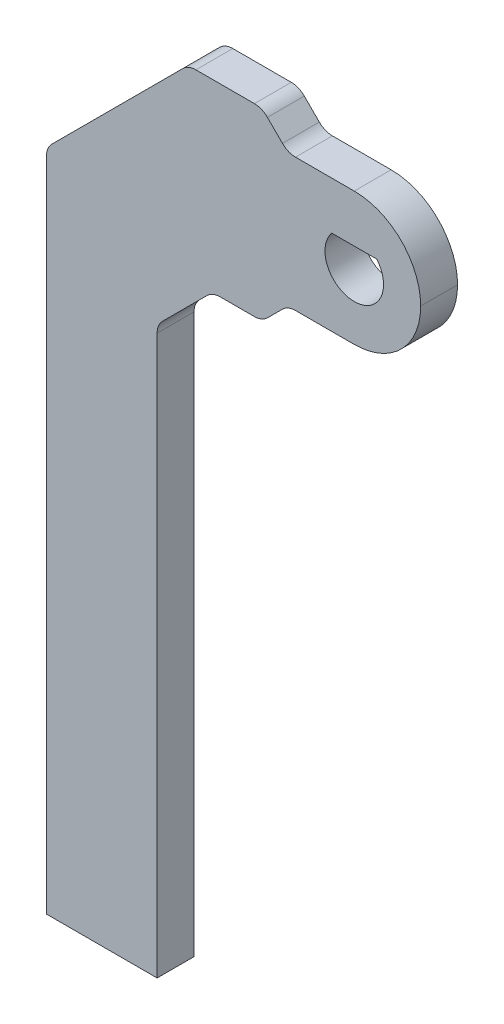
ISO-10303-21;
HEADER;
FILE_DESCRIPTION(('STEP AP214'),'2;1');
FILE_NAME('part.step','',(''),(''),'','','');
FILE_SCHEMA(('AUTOMOTIVE_DESIGN { 1 0 10303 214 1 1 1 1 }'));
ENDSEC;
DATA;
#1=APPLICATION_CONTEXT('core data for automotive mechanical design processes');
#2=APPLICATION_PROTOCOL_DEFINITION('international standard','automotive_design',2000,#1);
#3=PRODUCT_CONTEXT('',#1,'mechanical');
#4=PRODUCT('Part','Part','',(#3));
#5=PRODUCT_RELATED_PRODUCT_CATEGORY('part','',(#4));
#6=PRODUCT_DEFINITION_FORMATION('','',#4);
#7=PRODUCT_DEFINITION_CONTEXT('part definition',#1,'design');
#8=PRODUCT_DEFINITION('design','',#6,#7);
#9=PRODUCT_DEFINITION_SHAPE('','',#8);
#10=(LENGTH_UNIT() NAMED_UNIT(*) SI_UNIT(.MILLI.,.METRE.));
#11=(NAMED_UNIT(*) PLANE_ANGLE_UNIT() SI_UNIT($,.RADIAN.));
#12=(NAMED_UNIT(*) SI_UNIT($,.STERADIAN.) SOLID_ANGLE_UNIT());
#13=UNCERTAINTY_MEASURE_WITH_UNIT(LENGTH_MEASURE(1.E-05),#10,'distance_accuracy_value','');
#14=(GEOMETRIC_REPRESENTATION_CONTEXT(3) GLOBAL_UNCERTAINTY_ASSIGNED_CONTEXT((#13)) GLOBAL_UNIT_ASSIGNED_CONTEXT((#10,
#11,#12)) REPRESENTATION_CONTEXT('',''));
#15=CARTESIAN_POINT('',(0.,0.,0.));
#16=DIRECTION('',(0.,0.,1.));
#17=DIRECTION('',(1.,0.,0.));
#18=AXIS2_PLACEMENT_3D('',#15,#16,#17);
#19=CARTESIAN_POINT('',(0.,0.,5.));
#20=DIRECTION('',(0.,0.,-1.));
#21=DIRECTION('',(-1.,0.,0.));
#22=AXIS2_PLACEMENT_3D('',#19,#20,#21);
#23=PLANE('',#22);
#24=DIRECTION('',(1.,0.,0.));
#25=VECTOR('',#24,1.);
#26=CARTESIAN_POINT('',(29.2157287525381,84.2157287525381,5.));
#27=LINE('',#26,#25);
#28=CARTESIAN_POINT('',(23.5355339059327,84.2157287525381,5.));
#29=VERTEX_POINT('',#28);
#30=CARTESIAN_POINT('',(28.1801948466054,84.2157287525381,5.));
#31=VERTEX_POINT('',#30);
#32=EDGE_CURVE('E226',#29,#31,#27,.T.);
#33=ORIENTED_EDGE('',*,*,#32,.T.);
#34=CARTESIAN_POINT('',(28.1801948466054,86.7157287525381,5.));
#35=DIRECTION('',(0.,0.,-1.));
#36=DIRECTION('',(-1.,0.,0.));
#37=AXIS2_PLACEMENT_3D('',#34,#35,#36);
#38=CIRCLE('',#37,2.5);
#39=CARTESIAN_POINT('',(29.9479617995718,84.9479617995717,5.));
#40=VERTEX_POINT('',#39);
#41=EDGE_CURVE('E325',#31,#40,#38,.F.);
#42=ORIENTED_EDGE('',*,*,#41,.T.);
#43=DIRECTION('',(0.707106781186539,0.707106781186556,0.));
#44=VECTOR('',#43,1.);
#45=CARTESIAN_POINT('',(29.2157287525381,84.2157287525381,5.));
#46=LINE('',#45,#44);
#47=CARTESIAN_POINT('',(31.9834957055044,86.9834957055045,5.));
#48=VERTEX_POINT('',#47);
#49=EDGE_CURVE('E229',#40,#48,#46,.T.);
#50=ORIENTED_EDGE('',*,*,#49,.T.);
#51=CARTESIAN_POINT('',(33.7512626584708,85.2157287525381,5.));
#52=DIRECTION('',(0.,0.,-1.));
#53=DIRECTION('',(-1.,0.,0.));
#54=AXIS2_PLACEMENT_3D('',#51,#52,#53);
#55=CIRCLE('',#54,2.5);
#56=CARTESIAN_POINT('',(33.7512626584708,87.7157287525381,5.));
#57=VERTEX_POINT('',#56);
#58=EDGE_CURVE('E359',#48,#57,#55,.T.);
#59=ORIENTED_EDGE('',*,*,#58,.T.);
#60=DIRECTION('',(1.,0.,0.));
#61=VECTOR('',#60,1.);
#62=CARTESIAN_POINT('',(32.7157287525381,87.7157287525381,5.));
#63=LINE('',#62,#61);
#64=CARTESIAN_POINT('',(41.7157287525381,87.7157287525381,5.));
#65=VERTEX_POINT('',#64);
#66=EDGE_CURVE('E232',#57,#65,#63,.T.);
#67=ORIENTED_EDGE('',*,*,#66,.T.);
#68=CARTESIAN_POINT('',(41.7157287525381,96.7157287525381,5.));
#69=DIRECTION('',(0.,0.,-1.));
#70=DIRECTION('',(-1.,0.,0.));
#71=AXIS2_PLACEMENT_3D('',#68,#69,#70);
#72=CIRCLE('',#71,9.);
#73=CARTESIAN_POINT('',(50.7157287525381,96.7157287525381,5.));
#74=VERTEX_POINT('',#73);
#75=EDGE_CURVE('E291',#65,#74,#72,.F.);
#76=ORIENTED_EDGE('',*,*,#75,.T.);
#77=CARTESIAN_POINT('',(41.7157287525381,96.7157287525381,5.));
#78=DIRECTION('',(0.,0.,-1.));
#79=DIRECTION('',(-1.,0.,0.));
#80=AXIS2_PLACEMENT_3D('',#77,#78,#79);
#81=CIRCLE('',#80,9.);
#82=CARTESIAN_POINT('',(41.7157287525381,105.715728752538,5.));
#83=VERTEX_POINT('',#82);
#84=EDGE_CURVE('E289',#74,#83,#81,.F.);
#85=ORIENTED_EDGE('',*,*,#84,.T.);
#86=DIRECTION('',(-1.,0.,0.));
#87=VECTOR('',#86,1.);
#88=CARTESIAN_POINT('',(50.7157287525381,105.715728752538,5.));
#89=LINE('',#88,#87);
#90=CARTESIAN_POINT('',(33.7512626584708,105.715728752538,5.));
#91=VERTEX_POINT('',#90);
#92=EDGE_CURVE('E234',#83,#91,#89,.T.);
#93=ORIENTED_EDGE('',*,*,#92,.T.);
#94=CARTESIAN_POINT('',(33.7512626584708,108.215728752538,5.));
#95=DIRECTION('',(0.,0.,-1.));
#96=DIRECTION('',(-1.,0.,0.));
#97=AXIS2_PLACEMENT_3D('',#94,#95,#96);
#98=CIRCLE('',#97,2.5);
#99=CARTESIAN_POINT('',(31.9834957055045,106.447961799572,5.));
#100=VERTEX_POINT('',#99);
#101=EDGE_CURVE('E11',#91,#100,#98,.T.);
#102=ORIENTED_EDGE('',*,*,#101,.T.);
#103=DIRECTION('',(-0.707106781186544,0.707106781186551,0.));
#104=VECTOR('',#103,1.);
#105=CARTESIAN_POINT('',(32.7157287525381,105.715728752538,5.));
#106=LINE('',#105,#104);
#107=CARTESIAN_POINT('',(29.9479617995718,108.483495705504,5.));
#108=VERTEX_POINT('',#107);
#109=EDGE_CURVE('E237',#100,#108,#106,.T.);
#110=ORIENTED_EDGE('',*,*,#109,.T.);
#111=CARTESIAN_POINT('',(28.1801948466054,106.715728752538,5.));
#112=DIRECTION('',(0.,0.,-1.));
#113=DIRECTION('',(-1.,0.,0.));
#114=AXIS2_PLACEMENT_3D('',#111,#112,#113);
#115=CIRCLE('',#114,2.5);
#116=CARTESIAN_POINT('',(28.1801948466054,109.215728752538,5.));
#117=VERTEX_POINT('',#116);
#118=EDGE_CURVE('E320',#108,#117,#115,.F.);
#119=ORIENTED_EDGE('',*,*,#118,.T.);
#120=DIRECTION('',(-1.,0.,0.));
#121=VECTOR('',#120,1.);
#122=CARTESIAN_POINT('',(19.2157287525381,109.215728752538,5.));
#123=LINE('',#122,#121);
#124=CARTESIAN_POINT('',(20.2512626584709,109.215728752538,5.));
#125=VERTEX_POINT('',#124);
#126=EDGE_CURVE('E240',#117,#125,#123,.T.);
#127=ORIENTED_EDGE('',*,*,#126,.T.);
#128=CARTESIAN_POINT('',(20.2512626584709,106.715728752538,5.));
#129=DIRECTION('',(0.,0.,-1.));
#130=DIRECTION('',(-1.,0.,0.));
#131=AXIS2_PLACEMENT_3D('',#128,#129,#130);
#132=CIRCLE('',#131,2.5);
#133=CARTESIAN_POINT('',(18.4834957055045,108.483495705504,5.));
#134=VERTEX_POINT('',#133);
#135=EDGE_CURVE('E322',#125,#134,#132,.F.);
#136=ORIENTED_EDGE('',*,*,#135,.T.);
#137=DIRECTION('',(-0.707106781186548,-0.707106781186547,0.));
#138=VECTOR('',#137,1.);
#139=CARTESIAN_POINT('',(0.,90.,5.));
#140=LINE('',#139,#138);
#141=CARTESIAN_POINT('',(0.732233047033629,90.7322330470336,5.));
#142=VERTEX_POINT('',#141);
#143=EDGE_CURVE('E243',#134,#142,#140,.T.);
#144=ORIENTED_EDGE('',*,*,#143,.T.);
#145=CARTESIAN_POINT('',(2.5,88.9644660940673,5.));
#146=DIRECTION('',(0.,0.,-1.));
#147=DIRECTION('',(-1.,0.,0.));
#148=AXIS2_PLACEMENT_3D('',#145,#146,#147);
#149=CIRCLE('',#148,2.5);
#150=CARTESIAN_POINT('',(0.,88.9644660940672,5.));
#151=VERTEX_POINT('',#150);
#152=EDGE_CURVE('E48',#142,#151,#149,.F.);
#153=ORIENTED_EDGE('',*,*,#152,.T.);
#154=DIRECTION('',(0.,-1.,0.));
#155=VECTOR('',#154,1.);
#156=CARTESIAN_POINT('',(0.,0.,5.));
#157=LINE('',#156,#155);
#158=CARTESIAN_POINT('',(0.,0.,5.));
#159=VERTEX_POINT('',#158);
#160=EDGE_CURVE('E245',#151,#159,#157,.T.);
#161=ORIENTED_EDGE('',*,*,#160,.T.);
#162=DIRECTION('',(1.,0.,0.));
#163=VECTOR('',#162,1.);
#164=CARTESIAN_POINT('',(15.,0.,5.));
#165=LINE('',#164,#163);
#166=CARTESIAN_POINT('',(15.,0.,5.));
#167=VERTEX_POINT('',#166);
#168=EDGE_CURVE('E216',#159,#167,#165,.T.);
#169=ORIENTED_EDGE('',*,*,#168,.T.);
#170=DIRECTION('',(0.,1.,0.));
#171=VECTOR('',#170,1.);
#172=CARTESIAN_POINT('',(15.,76.7157287525381,5.));
#173=LINE('',#172,#171);
#174=CARTESIAN_POINT('',(15.,75.6801948466053,5.));
#175=VERTEX_POINT('',#174);
#176=EDGE_CURVE('E219',#167,#175,#173,.T.);
#177=ORIENTED_EDGE('',*,*,#176,.T.);
#178=CARTESIAN_POINT('',(17.5,75.6801948466053,5.));
#179=DIRECTION('',(0.,0.,-1.));
#180=DIRECTION('',(-1.,0.,0.));
#181=AXIS2_PLACEMENT_3D('',#178,#179,#180);
#182=CIRCLE('',#181,2.5);
#183=CARTESIAN_POINT('',(15.7322330470336,77.4479617995717,5.));
#184=VERTEX_POINT('',#183);
#185=EDGE_CURVE('E351',#175,#184,#182,.T.);
#186=ORIENTED_EDGE('',*,*,#185,.T.);
#187=DIRECTION('',(0.707106781186548,0.707106781186547,0.));
#188=VECTOR('',#187,1.);
#189=CARTESIAN_POINT('',(22.5,84.2157287525381,5.));
#190=LINE('',#189,#188);
#191=CARTESIAN_POINT('',(21.7677669529664,83.4834957055045,5.));
#192=VERTEX_POINT('',#191);
#193=EDGE_CURVE('E223',#184,#192,#190,.T.);
#194=ORIENTED_EDGE('',*,*,#193,.T.);
#195=CARTESIAN_POINT('',(23.5355339059327,81.7157287525381,5.));
#196=DIRECTION('',(0.,0.,-1.));
#197=DIRECTION('',(-1.,0.,0.));
#198=AXIS2_PLACEMENT_3D('',#195,#196,#197);
#199=CIRCLE('',#198,2.5);
#200=EDGE_CURVE('E355',#192,#29,#199,.T.);
#201=ORIENTED_EDGE('',*,*,#200,.T.);
#202=EDGE_LOOP('',(#33,#42,#50,#59,#67,#76,#85,#93,#102,#110,#119,#127,#136,#144,#153,#161,#169,
#177,#186,#194,#201));
#203=FACE_BOUND('',#202,.T.);
#204=CARTESIAN_POINT('',(41.7157287525381,96.7157287525381,5.));
#205=DIRECTION('',(0.,0.,1.));
#206=DIRECTION('',(1.,0.,0.));
#207=AXIS2_PLACEMENT_3D('',#204,#205,#206);
#208=CIRCLE('',#207,3.96874999999999);
#209=CARTESIAN_POINT('',(38.6662408344607,99.2557287525381,5.));
#210=VERTEX_POINT('',#209);
#211=CARTESIAN_POINT('',(44.7652166706155,99.2557287525381,5.));
#212=VERTEX_POINT('',#211);
#213=EDGE_CURVE('E188',#210,#212,#208,.T.);
#214=ORIENTED_EDGE('',*,*,#213,.F.);
#215=DIRECTION('',(1.,0.,0.));
#216=VECTOR('',#215,1.);
#217=CARTESIAN_POINT('',(38.6662408344607,99.2557287525381,5.));
#218=LINE('',#217,#216);
#219=EDGE_CURVE('E191',#210,#212,#218,.T.);
#220=ORIENTED_EDGE('',*,*,#219,.T.);
#221=EDGE_LOOP('',(#214,#220));
#222=FACE_BOUND('',#221,.T.);
#223=ADVANCED_FACE('F33',(#203,#222),#23,.F.);
#224=CARTESIAN_POINT('',(0.,0.,0.));
#225=DIRECTION('',(0.,0.,-1.));
#226=DIRECTION('',(-1.,0.,0.));
#227=AXIS2_PLACEMENT_3D('',#224,#225,#226);
#228=PLANE('',#227);
#229=DIRECTION('',(0.707106781186539,0.707106781186556,0.));
#230=VECTOR('',#229,1.);
#231=CARTESIAN_POINT('',(29.2157287525381,84.2157287525381,0.));
#232=LINE('',#231,#230);
#233=CARTESIAN_POINT('',(29.9479617995718,84.9479617995717,0.));
#234=VERTEX_POINT('',#233);
#235=CARTESIAN_POINT('',(31.9834957055044,86.9834957055045,0.));
#236=VERTEX_POINT('',#235);
#237=EDGE_CURVE('E259',#234,#236,#232,.T.);
#238=ORIENTED_EDGE('',*,*,#237,.F.);
#239=CARTESIAN_POINT('',(28.1801948466054,86.7157287525381,0.));
#240=DIRECTION('',(0.,0.,-1.));
#241=DIRECTION('',(-1.,0.,0.));
#242=AXIS2_PLACEMENT_3D('',#239,#240,#241);
#243=CIRCLE('',#242,2.5);
#244=CARTESIAN_POINT('',(28.1801948466054,84.2157287525381,0.));
#245=VERTEX_POINT('',#244);
#246=EDGE_CURVE('E318',#234,#245,#243,.T.);
#247=ORIENTED_EDGE('',*,*,#246,.T.);
#248=DIRECTION('',(1.,0.,0.));
#249=VECTOR('',#248,1.);
#250=CARTESIAN_POINT('',(29.2157287525381,84.2157287525381,0.));
#251=LINE('',#250,#249);
#252=CARTESIAN_POINT('',(23.5355339059327,84.2157287525381,0.));
#253=VERTEX_POINT('',#252);
#254=EDGE_CURVE('E256',#253,#245,#251,.T.);
#255=ORIENTED_EDGE('',*,*,#254,.F.);
#256=CARTESIAN_POINT('',(23.5355339059327,81.7157287525381,0.));
#257=DIRECTION('',(0.,0.,-1.));
#258=DIRECTION('',(-1.,0.,0.));
#259=AXIS2_PLACEMENT_3D('',#256,#257,#258);
#260=CIRCLE('',#259,2.5);
#261=CARTESIAN_POINT('',(21.7677669529664,83.4834957055045,0.));
#262=VERTEX_POINT('',#261);
#263=EDGE_CURVE('E353',#253,#262,#260,.F.);
#264=ORIENTED_EDGE('',*,*,#263,.T.);
#265=DIRECTION('',(0.707106781186548,0.707106781186547,0.));
#266=VECTOR('',#265,1.);
#267=CARTESIAN_POINT('',(22.5,84.2157287525381,0.));
#268=LINE('',#267,#266);
#269=CARTESIAN_POINT('',(15.7322330470336,77.4479617995717,0.));
#270=VERTEX_POINT('',#269);
#271=EDGE_CURVE('E253',#270,#262,#268,.T.);
#272=ORIENTED_EDGE('',*,*,#271,.F.);
#273=CARTESIAN_POINT('',(17.5,75.6801948466053,0.));
#274=DIRECTION('',(0.,0.,-1.));
#275=DIRECTION('',(-1.,0.,0.));
#276=AXIS2_PLACEMENT_3D('',#273,#274,#275);
#277=CIRCLE('',#276,2.5);
#278=CARTESIAN_POINT('',(15.,75.6801948466053,0.));
#279=VERTEX_POINT('',#278);
#280=EDGE_CURVE('E349',#270,#279,#277,.F.);
#281=ORIENTED_EDGE('',*,*,#280,.T.);
#282=DIRECTION('',(0.,1.,0.));
#283=VECTOR('',#282,1.);
#284=CARTESIAN_POINT('',(15.,76.7157287525381,0.));
#285=LINE('',#284,#283);
#286=CARTESIAN_POINT('',(15.,0.,0.));
#287=VERTEX_POINT('',#286);
#288=EDGE_CURVE('E250',#287,#279,#285,.T.);
#289=ORIENTED_EDGE('',*,*,#288,.F.);
#290=DIRECTION('',(1.,0.,0.));
#291=VECTOR('',#290,1.);
#292=CARTESIAN_POINT('',(15.,0.,0.));
#293=LINE('',#292,#291);
#294=CARTESIAN_POINT('',(0.,0.,0.));
#295=VERTEX_POINT('',#294);
#296=EDGE_CURVE('E194',#295,#287,#293,.T.);
#297=ORIENTED_EDGE('',*,*,#296,.F.);
#298=DIRECTION('',(0.,-1.,0.));
#299=VECTOR('',#298,1.);
#300=CARTESIAN_POINT('',(0.,0.,0.));
#301=LINE('',#300,#299);
#302=CARTESIAN_POINT('',(0.,88.9644660940672,0.));
#303=VERTEX_POINT('',#302);
#304=EDGE_CURVE('E220',#303,#295,#301,.T.);
#305=ORIENTED_EDGE('',*,*,#304,.F.);
#306=CARTESIAN_POINT('',(2.5,88.9644660940673,0.));
#307=DIRECTION('',(0.,0.,-1.));
#308=DIRECTION('',(-1.,0.,0.));
#309=AXIS2_PLACEMENT_3D('',#306,#307,#308);
#310=CIRCLE('',#309,2.5);
#311=CARTESIAN_POINT('',(0.732233047033629,90.7322330470336,0.));
#312=VERTEX_POINT('',#311);
#313=EDGE_CURVE('E316',#303,#312,#310,.T.);
#314=ORIENTED_EDGE('',*,*,#313,.T.);
#315=DIRECTION('',(-0.707106781186548,-0.707106781186547,0.));
#316=VECTOR('',#315,1.);
#317=CARTESIAN_POINT('',(0.,90.,0.));
#318=LINE('',#317,#316);
#319=CARTESIAN_POINT('',(18.4834957055045,108.483495705504,0.));
#320=VERTEX_POINT('',#319);
#321=EDGE_CURVE('E273',#320,#312,#318,.T.);
#322=ORIENTED_EDGE('',*,*,#321,.F.);
#323=CARTESIAN_POINT('',(20.2512626584709,106.715728752538,0.));
#324=DIRECTION('',(0.,0.,-1.));
#325=DIRECTION('',(-1.,0.,0.));
#326=AXIS2_PLACEMENT_3D('',#323,#324,#325);
#327=CIRCLE('',#326,2.5);
#328=CARTESIAN_POINT('',(20.2512626584709,109.215728752538,0.));
#329=VERTEX_POINT('',#328);
#330=EDGE_CURVE('E314',#320,#329,#327,.T.);
#331=ORIENTED_EDGE('',*,*,#330,.T.);
#332=DIRECTION('',(-1.,0.,0.));
#333=VECTOR('',#332,1.);
#334=CARTESIAN_POINT('',(19.2157287525381,109.215728752538,0.));
#335=LINE('',#334,#333);
#336=CARTESIAN_POINT('',(28.1801948466054,109.215728752538,0.));
#337=VERTEX_POINT('',#336);
#338=EDGE_CURVE('E270',#337,#329,#335,.T.);
#339=ORIENTED_EDGE('',*,*,#338,.F.);
#340=CARTESIAN_POINT('',(28.1801948466054,106.715728752538,0.));
#341=DIRECTION('',(0.,0.,-1.));
#342=DIRECTION('',(-1.,0.,0.));
#343=AXIS2_PLACEMENT_3D('',#340,#341,#342);
#344=CIRCLE('',#343,2.5);
#345=CARTESIAN_POINT('',(29.9479617995718,108.483495705504,0.));
#346=VERTEX_POINT('',#345);
#347=EDGE_CURVE('E312',#337,#346,#344,.T.);
#348=ORIENTED_EDGE('',*,*,#347,.T.);
#349=DIRECTION('',(-0.707106781186544,0.707106781186551,0.));
#350=VECTOR('',#349,1.);
#351=CARTESIAN_POINT('',(32.7157287525381,105.715728752538,0.));
#352=LINE('',#351,#350);
#353=CARTESIAN_POINT('',(31.9834957055045,106.447961799572,0.));
#354=VERTEX_POINT('',#353);
#355=EDGE_CURVE('E267',#354,#346,#352,.T.);
#356=ORIENTED_EDGE('',*,*,#355,.F.);
#357=CARTESIAN_POINT('',(33.7512626584708,108.215728752538,0.));
#358=DIRECTION('',(0.,0.,-1.));
#359=DIRECTION('',(-1.,0.,0.));
#360=AXIS2_PLACEMENT_3D('',#357,#358,#359);
#361=CIRCLE('',#360,2.5);
#362=CARTESIAN_POINT('',(33.7512626584708,105.715728752538,0.));
#363=VERTEX_POINT('',#362);
#364=EDGE_CURVE('E41',#354,#363,#361,.F.);
#365=ORIENTED_EDGE('',*,*,#364,.T.);
#366=DIRECTION('',(-1.,0.,0.));
#367=VECTOR('',#366,1.);
#368=CARTESIAN_POINT('',(50.7157287525381,105.715728752538,0.));
#369=LINE('',#368,#367);
#370=CARTESIAN_POINT('',(41.7157287525381,105.715728752538,0.));
#371=VERTEX_POINT('',#370);
#372=EDGE_CURVE('E264',#371,#363,#369,.T.);
#373=ORIENTED_EDGE('',*,*,#372,.F.);
#374=CARTESIAN_POINT('',(41.7157287525381,96.7157287525381,0.));
#375=DIRECTION('',(0.,0.,-1.));
#376=DIRECTION('',(-1.,0.,0.));
#377=AXIS2_PLACEMENT_3D('',#374,#375,#376);
#378=CIRCLE('',#377,9.);
#379=CARTESIAN_POINT('',(50.7157287525381,96.7157287525381,0.));
#380=VERTEX_POINT('',#379);
#381=EDGE_CURVE('E281',#371,#380,#378,.T.);
#382=ORIENTED_EDGE('',*,*,#381,.T.);
#383=CARTESIAN_POINT('',(41.7157287525381,96.7157287525381,0.));
#384=DIRECTION('',(0.,0.,-1.));
#385=DIRECTION('',(-1.,0.,0.));
#386=AXIS2_PLACEMENT_3D('',#383,#384,#385);
#387=CIRCLE('',#386,9.);
#388=CARTESIAN_POINT('',(41.7157287525381,87.7157287525381,0.));
#389=VERTEX_POINT('',#388);
#390=EDGE_CURVE('E283',#380,#389,#387,.T.);
#391=ORIENTED_EDGE('',*,*,#390,.T.);
#392=DIRECTION('',(1.,0.,0.));
#393=VECTOR('',#392,1.);
#394=CARTESIAN_POINT('',(32.7157287525381,87.7157287525381,0.));
#395=LINE('',#394,#393);
#396=CARTESIAN_POINT('',(33.7512626584708,87.7157287525381,0.));
#397=VERTEX_POINT('',#396);
#398=EDGE_CURVE('E262',#397,#389,#395,.T.);
#399=ORIENTED_EDGE('',*,*,#398,.F.);
#400=CARTESIAN_POINT('',(33.7512626584708,85.2157287525381,0.));
#401=DIRECTION('',(0.,0.,-1.));
#402=DIRECTION('',(-1.,0.,0.));
#403=AXIS2_PLACEMENT_3D('',#400,#401,#402);
#404=CIRCLE('',#403,2.5);
#405=EDGE_CURVE('E357',#397,#236,#404,.F.);
#406=ORIENTED_EDGE('',*,*,#405,.T.);
#407=EDGE_LOOP('',(#238,#247,#255,#264,#272,#281,#289,#297,#305,#314,#322,#331,#339,#348,#356,
#365,#373,#382,#391,#399,#406));
#408=FACE_BOUND('',#407,.T.);
#409=CARTESIAN_POINT('',(41.7157287525381,96.7157287525381,0.));
#410=DIRECTION('',(0.,0.,1.));
#411=DIRECTION('',(1.,0.,0.));
#412=AXIS2_PLACEMENT_3D('',#409,#410,#411);
#413=CIRCLE('',#412,3.96874999999999);
#414=CARTESIAN_POINT('',(38.6662408344607,99.2557287525381,0.));
#415=VERTEX_POINT('',#414);
#416=CARTESIAN_POINT('',(44.7652166706155,99.2557287525381,0.));
#417=VERTEX_POINT('',#416);
#418=EDGE_CURVE('E195',#415,#417,#413,.T.);
#419=ORIENTED_EDGE('',*,*,#418,.T.);
#420=DIRECTION('',(1.,0.,0.));
#421=VECTOR('',#420,1.);
#422=CARTESIAN_POINT('',(38.6662408344607,99.2557287525381,0.));
#423=LINE('',#422,#421);
#424=EDGE_CURVE('E205',#415,#417,#423,.T.);
#425=ORIENTED_EDGE('',*,*,#424,.F.);
#426=EDGE_LOOP('',(#419,#425));
#427=FACE_BOUND('',#426,.T.);
#428=ADVANCED_FACE('F364',(#408,#427),#228,.T.);
#429=CARTESIAN_POINT('',(15.,0.,5.));
#430=DIRECTION('',(0.,1.,0.));
#431=DIRECTION('',(0.,0.,1.));
#432=AXIS2_PLACEMENT_3D('',#429,#430,#431);
#433=PLANE('',#432);
#434=ORIENTED_EDGE('',*,*,#296,.T.);
#435=DIRECTION('',(0.,0.,-1.));
#436=VECTOR('',#435,1.);
#437=CARTESIAN_POINT('',(15.,0.,5.));
#438=LINE('',#437,#436);
#439=EDGE_CURVE('E278',#167,#287,#438,.T.);
#440=ORIENTED_EDGE('',*,*,#439,.F.);
#441=ORIENTED_EDGE('',*,*,#168,.F.);
#442=DIRECTION('',(0.,0.,-1.));
#443=VECTOR('',#442,1.);
#444=CARTESIAN_POINT('',(0.,0.,5.));
#445=LINE('',#444,#443);
#446=EDGE_CURVE('E247',#159,#295,#445,.T.);
#447=ORIENTED_EDGE('',*,*,#446,.T.);
#448=EDGE_LOOP('',(#434,#440,#441,#447));
#449=FACE_BOUND('',#448,.T.);
#450=ADVANCED_FACE('F406',(#449),#433,.F.);
#451=CARTESIAN_POINT('',(15.,76.7157287525381,5.));
#452=DIRECTION('',(-1.,0.,0.));
#453=DIRECTION('',(0.,-1.,0.));
#454=AXIS2_PLACEMENT_3D('',#451,#452,#453);
#455=PLANE('',#454);
#456=ORIENTED_EDGE('',*,*,#288,.T.);
#457=DIRECTION('',(0.,0.,-1.));
#458=VECTOR('',#457,1.);
#459=CARTESIAN_POINT('',(15.,75.6801948466053,5.));
#460=LINE('',#459,#458);
#461=EDGE_CURVE('E300',#279,#175,#460,.F.);
#462=ORIENTED_EDGE('',*,*,#461,.T.);
#463=ORIENTED_EDGE('',*,*,#176,.F.);
#464=ORIENTED_EDGE('',*,*,#439,.T.);
#465=EDGE_LOOP('',(#456,#462,#463,#464));
#466=FACE_BOUND('',#465,.T.);
#467=ADVANCED_FACE('F408',(#466),#455,.F.);
#468=CARTESIAN_POINT('',(22.5,84.2157287525381,5.));
#469=DIRECTION('',(-0.707106781186547,0.707106781186548,0.));
#470=DIRECTION('',(-0.707106781186548,-0.707106781186547,0.));
#471=AXIS2_PLACEMENT_3D('',#468,#469,#470);
#472=PLANE('',#471);
#473=ORIENTED_EDGE('',*,*,#193,.F.);
#474=DIRECTION('',(0.,0.,-1.));
#475=VECTOR('',#474,1.);
#476=CARTESIAN_POINT('',(15.7322330470336,77.4479617995717,0.));
#477=LINE('',#476,#475);
#478=EDGE_CURVE('E297',#184,#270,#477,.T.);
#479=ORIENTED_EDGE('',*,*,#478,.T.);
#480=ORIENTED_EDGE('',*,*,#271,.T.);
#481=DIRECTION('',(0.,0.,-1.));
#482=VECTOR('',#481,1.);
#483=CARTESIAN_POINT('',(21.7677669529664,83.4834957055045,5.));
#484=LINE('',#483,#482);
#485=EDGE_CURVE('E294',#262,#192,#484,.F.);
#486=ORIENTED_EDGE('',*,*,#485,.T.);
#487=EDGE_LOOP('',(#473,#479,#480,#486));
#488=FACE_BOUND('',#487,.T.);
#489=ADVANCED_FACE('F416',(#488),#472,.F.);
#490=CARTESIAN_POINT('',(29.2157287525381,84.2157287525381,5.));
#491=DIRECTION('',(0.,1.,0.));
#492=DIRECTION('',(0.,0.,1.));
#493=AXIS2_PLACEMENT_3D('',#490,#491,#492);
#494=PLANE('',#493);
#495=ORIENTED_EDGE('',*,*,#32,.F.);
#496=DIRECTION('',(0.,0.,-1.));
#497=VECTOR('',#496,1.);
#498=CARTESIAN_POINT('',(23.5355339059327,84.2157287525381,0.));
#499=LINE('',#498,#497);
#500=EDGE_CURVE('E304',#29,#253,#499,.T.);
#501=ORIENTED_EDGE('',*,*,#500,.T.);
#502=ORIENTED_EDGE('',*,*,#254,.T.);
#503=DIRECTION('',(0.,0.,-1.));
#504=VECTOR('',#503,1.);
#505=CARTESIAN_POINT('',(28.1801948466054,84.2157287525381,5.));
#506=LINE('',#505,#504);
#507=EDGE_CURVE('E302',#245,#31,#506,.F.);
#508=ORIENTED_EDGE('',*,*,#507,.T.);
#509=EDGE_LOOP('',(#495,#501,#502,#508));
#510=FACE_BOUND('',#509,.T.);
#511=ADVANCED_FACE('F425',(#510),#494,.F.);
#512=CARTESIAN_POINT('',(29.2157287525381,84.2157287525381,5.));
#513=DIRECTION('',(-0.707106781186556,0.707106781186539,0.));
#514=DIRECTION('',(-0.707106781186539,-0.707106781186556,0.));
#515=AXIS2_PLACEMENT_3D('',#512,#513,#514);
#516=PLANE('',#515);
#517=ORIENTED_EDGE('',*,*,#49,.F.);
#518=DIRECTION('',(0.,0.,-1.));
#519=VECTOR('',#518,1.);
#520=CARTESIAN_POINT('',(29.9479617995718,84.9479617995717,5.));
#521=LINE('',#520,#519);
#522=EDGE_CURVE('E309',#40,#234,#521,.T.);
#523=ORIENTED_EDGE('',*,*,#522,.T.);
#524=ORIENTED_EDGE('',*,*,#237,.T.);
#525=DIRECTION('',(0.,0.,-1.));
#526=VECTOR('',#525,1.);
#527=CARTESIAN_POINT('',(31.9834957055044,86.9834957055045,5.));
#528=LINE('',#527,#526);
#529=EDGE_CURVE('E307',#236,#48,#528,.F.);
#530=ORIENTED_EDGE('',*,*,#529,.T.);
#531=EDGE_LOOP('',(#517,#523,#524,#530));
#532=FACE_BOUND('',#531,.T.);
#533=ADVANCED_FACE('F434',(#532),#516,.F.);
#534=CARTESIAN_POINT('',(32.7157287525381,87.7157287525381,5.));
#535=DIRECTION('',(0.,1.,0.));
#536=DIRECTION('',(-1.,0.,0.));
#537=AXIS2_PLACEMENT_3D('',#534,#535,#536);
#538=PLANE('',#537);
#539=ORIENTED_EDGE('',*,*,#66,.F.);
#540=DIRECTION('',(0.,0.,-1.));
#541=VECTOR('',#540,1.);
#542=CARTESIAN_POINT('',(33.7512626584708,87.7157287525381,0.));
#543=LINE('',#542,#541);
#544=EDGE_CURVE('E327',#57,#397,#543,.T.);
#545=ORIENTED_EDGE('',*,*,#544,.T.);
#546=ORIENTED_EDGE('',*,*,#398,.T.);
#547=DIRECTION('',(0.,0.,-1.));
#548=VECTOR('',#547,1.);
#549=CARTESIAN_POINT('',(41.7157287525381,87.7157287525381,5.));
#550=LINE('',#549,#548);
#551=EDGE_CURVE('E286',#389,#65,#550,.F.);
#552=ORIENTED_EDGE('',*,*,#551,.T.);
#553=EDGE_LOOP('',(#539,#545,#546,#552));
#554=FACE_BOUND('',#553,.T.);
#555=ADVANCED_FACE('F442',(#554),#538,.F.);
#556=CARTESIAN_POINT('',(50.7157287525381,105.715728752538,5.));
#557=DIRECTION('',(0.,-1.,0.));
#558=DIRECTION('',(0.,0.,-1.));
#559=AXIS2_PLACEMENT_3D('',#556,#557,#558);
#560=PLANE('',#559);
#561=ORIENTED_EDGE('',*,*,#372,.T.);
#562=DIRECTION('',(0.,0.,-1.));
#563=VECTOR('',#562,1.);
#564=CARTESIAN_POINT('',(33.7512626584708,105.715728752538,5.));
#565=LINE('',#564,#563);
#566=EDGE_CURVE('E347',#363,#91,#565,.F.);
#567=ORIENTED_EDGE('',*,*,#566,.T.);
#568=ORIENTED_EDGE('',*,*,#92,.F.);
#569=DIRECTION('',(0.,0.,-1.));
#570=VECTOR('',#569,1.);
#571=CARTESIAN_POINT('',(41.7157287525381,105.715728752538,5.));
#572=LINE('',#571,#570);
#573=EDGE_CURVE('E293',#83,#371,#572,.T.);
#574=ORIENTED_EDGE('',*,*,#573,.T.);
#575=EDGE_LOOP('',(#561,#567,#568,#574));
#576=FACE_BOUND('',#575,.T.);
#577=ADVANCED_FACE('F371',(#576),#560,.F.);
#578=CARTESIAN_POINT('',(32.7157287525381,105.715728752538,5.));
#579=DIRECTION('',(-0.707106781186551,-0.707106781186544,0.));
#580=DIRECTION('',(0.707106781186544,-0.707106781186551,0.));
#581=AXIS2_PLACEMENT_3D('',#578,#579,#580);
#582=PLANE('',#581);
#583=ORIENTED_EDGE('',*,*,#355,.T.);
#584=DIRECTION('',(0.,0.,-1.));
#585=VECTOR('',#584,1.);
#586=CARTESIAN_POINT('',(29.9479617995718,108.483495705504,5.));
#587=LINE('',#586,#585);
#588=EDGE_CURVE('E345',#346,#108,#587,.F.);
#589=ORIENTED_EDGE('',*,*,#588,.T.);
#590=ORIENTED_EDGE('',*,*,#109,.F.);
#591=DIRECTION('',(0.,0.,-1.));
#592=VECTOR('',#591,1.);
#593=CARTESIAN_POINT('',(31.9834957055045,106.447961799572,0.));
#594=LINE('',#593,#592);
#595=EDGE_CURVE('E342',#100,#354,#594,.T.);
#596=ORIENTED_EDGE('',*,*,#595,.T.);
#597=EDGE_LOOP('',(#583,#589,#590,#596));
#598=FACE_BOUND('',#597,.T.);
#599=ADVANCED_FACE('F378',(#598),#582,.F.);
#600=CARTESIAN_POINT('',(19.2157287525381,109.215728752538,5.));
#601=DIRECTION('',(0.,-1.,0.));
#602=DIRECTION('',(0.,0.,-1.));
#603=AXIS2_PLACEMENT_3D('',#600,#601,#602);
#604=PLANE('',#603);
#605=ORIENTED_EDGE('',*,*,#338,.T.);
#606=DIRECTION('',(0.,0.,-1.));
#607=VECTOR('',#606,1.);
#608=CARTESIAN_POINT('',(20.2512626584709,109.215728752538,5.));
#609=LINE('',#608,#607);
#610=EDGE_CURVE('E340',#329,#125,#609,.F.);
#611=ORIENTED_EDGE('',*,*,#610,.T.);
#612=ORIENTED_EDGE('',*,*,#126,.F.);
#613=DIRECTION('',(0.,0.,-1.));
#614=VECTOR('',#613,1.);
#615=CARTESIAN_POINT('',(28.1801948466054,109.215728752538,5.));
#616=LINE('',#615,#614);
#617=EDGE_CURVE('E337',#117,#337,#616,.T.);
#618=ORIENTED_EDGE('',*,*,#617,.T.);
#619=EDGE_LOOP('',(#605,#611,#612,#618));
#620=FACE_BOUND('',#619,.T.);
#621=ADVANCED_FACE('F386',(#620),#604,.F.);
#622=CARTESIAN_POINT('',(0.,90.,5.));
#623=DIRECTION('',(0.707106781186547,-0.707106781186548,0.));
#624=DIRECTION('',(0.707106781186548,0.707106781186547,0.));
#625=AXIS2_PLACEMENT_3D('',#622,#623,#624);
#626=PLANE('',#625);
#627=ORIENTED_EDGE('',*,*,#321,.T.);
#628=DIRECTION('',(0.,0.,-1.));
#629=VECTOR('',#628,1.);
#630=CARTESIAN_POINT('',(0.732233047033631,90.7322330470336,5.));
#631=LINE('',#630,#629);
#632=EDGE_CURVE('E56',#312,#142,#631,.F.);
#633=ORIENTED_EDGE('',*,*,#632,.T.);
#634=ORIENTED_EDGE('',*,*,#143,.F.);
#635=DIRECTION('',(0.,0.,-1.));
#636=VECTOR('',#635,1.);
#637=CARTESIAN_POINT('',(18.4834957055045,108.483495705504,5.));
#638=LINE('',#637,#636);
#639=EDGE_CURVE('E333',#134,#320,#638,.T.);
#640=ORIENTED_EDGE('',*,*,#639,.T.);
#641=EDGE_LOOP('',(#627,#633,#634,#640));
#642=FACE_BOUND('',#641,.T.);
#643=ADVANCED_FACE('F392',(#642),#626,.F.);
#644=CARTESIAN_POINT('',(0.,0.,5.));
#645=DIRECTION('',(1.,0.,0.));
#646=DIRECTION('',(0.,0.,-1.));
#647=AXIS2_PLACEMENT_3D('',#644,#645,#646);
#648=PLANE('',#647);
#649=ORIENTED_EDGE('',*,*,#160,.F.);
#650=DIRECTION('',(0.,0.,-1.));
#651=VECTOR('',#650,1.);
#652=CARTESIAN_POINT('',(0.,88.9644660940673,5.));
#653=LINE('',#652,#651);
#654=EDGE_CURVE('E330',#151,#303,#653,.T.);
#655=ORIENTED_EDGE('',*,*,#654,.T.);
#656=ORIENTED_EDGE('',*,*,#304,.T.);
#657=ORIENTED_EDGE('',*,*,#446,.F.);
#658=EDGE_LOOP('',(#649,#655,#656,#657));
#659=FACE_BOUND('',#658,.T.);
#660=ADVANCED_FACE('F400',(#659),#648,.F.);
#661=CARTESIAN_POINT('',(41.7157287525381,96.7157287525381,5.));
#662=DIRECTION('',(0.,0.,-1.));
#663=DIRECTION('',(-1.,0.,0.));
#664=AXIS2_PLACEMENT_3D('',#661,#662,#663);
#665=CYLINDRICAL_SURFACE('',#664,3.96874999999999);
#666=DIRECTION('',(0.,0.,1.));
#667=VECTOR('',#666,1.);
#668=CARTESIAN_POINT('',(38.6662408344607,99.2557287525381,0.));
#669=LINE('',#668,#667);
#670=EDGE_CURVE('E198',#415,#210,#669,.T.);
#671=ORIENTED_EDGE('',*,*,#670,.T.);
#672=ORIENTED_EDGE('',*,*,#213,.T.);
#673=DIRECTION('',(0.,0.,1.));
#674=VECTOR('',#673,1.);
#675=CARTESIAN_POINT('',(44.7652166706155,99.2557287525381,0.));
#676=LINE('',#675,#674);
#677=EDGE_CURVE('E204',#417,#212,#676,.T.);
#678=ORIENTED_EDGE('',*,*,#677,.F.);
#679=ORIENTED_EDGE('',*,*,#418,.F.);
#680=EDGE_LOOP('',(#671,#672,#678,#679));
#681=FACE_BOUND('',#680,.T.);
#682=ADVANCED_FACE('F199',(#681),#665,.F.);
#683=CARTESIAN_POINT('',(38.6662408344607,99.2557287525381,0.));
#684=DIRECTION('',(0.,-1.,0.));
#685=DIRECTION('',(0.,0.,-1.));
#686=AXIS2_PLACEMENT_3D('',#683,#684,#685);
#687=PLANE('',#686);
#688=ORIENTED_EDGE('',*,*,#219,.F.);
#689=ORIENTED_EDGE('',*,*,#670,.F.);
#690=ORIENTED_EDGE('',*,*,#424,.T.);
#691=ORIENTED_EDGE('',*,*,#677,.T.);
#692=EDGE_LOOP('',(#688,#689,#690,#691));
#693=FACE_BOUND('',#692,.T.);
#694=ADVANCED_FACE('F207',(#693),#687,.T.);
#695=CARTESIAN_POINT('',(41.7157287525381,96.7157287525381,5.));
#696=DIRECTION('',(0.,0.,-1.));
#697=DIRECTION('',(-1.,0.,0.));
#698=AXIS2_PLACEMENT_3D('',#695,#696,#697);
#699=CYLINDRICAL_SURFACE('',#698,9.);
#700=ORIENTED_EDGE('',*,*,#573,.F.);
#701=ORIENTED_EDGE('',*,*,#84,.F.);
#702=DIRECTION('',(0.,0.,-1.));
#703=VECTOR('',#702,1.);
#704=CARTESIAN_POINT('',(50.7157287525381,96.7157287525381,5.));
#705=LINE('',#704,#703);
#706=EDGE_CURVE('E208',#380,#74,#705,.F.);
#707=ORIENTED_EDGE('',*,*,#706,.F.);
#708=ORIENTED_EDGE('',*,*,#381,.F.);
#709=EDGE_LOOP('',(#700,#701,#707,#708));
#710=FACE_BOUND('',#709,.T.);
#711=ADVANCED_FACE('F451',(#710),#699,.T.);
#712=CARTESIAN_POINT('',(41.7157287525381,96.7157287525381,5.));
#713=DIRECTION('',(0.,0.,-1.));
#714=DIRECTION('',(-1.,0.,0.));
#715=AXIS2_PLACEMENT_3D('',#712,#713,#714);
#716=CYLINDRICAL_SURFACE('',#715,9.);
#717=ORIENTED_EDGE('',*,*,#75,.F.);
#718=ORIENTED_EDGE('',*,*,#551,.F.);
#719=ORIENTED_EDGE('',*,*,#390,.F.);
#720=ORIENTED_EDGE('',*,*,#706,.T.);
#721=EDGE_LOOP('',(#717,#718,#719,#720));
#722=FACE_BOUND('',#721,.T.);
#723=ADVANCED_FACE('F447',(#722),#716,.T.);
#724=CARTESIAN_POINT('',(17.5,75.6801948466053,5.));
#725=DIRECTION('',(0.,0.,1.));
#726=DIRECTION('',(1.,0.,0.));
#727=AXIS2_PLACEMENT_3D('',#724,#725,#726);
#728=CYLINDRICAL_SURFACE('',#727,2.5);
#729=ORIENTED_EDGE('',*,*,#185,.F.);
#730=ORIENTED_EDGE('',*,*,#461,.F.);
#731=ORIENTED_EDGE('',*,*,#280,.F.);
#732=ORIENTED_EDGE('',*,*,#478,.F.);
#733=EDGE_LOOP('',(#729,#730,#731,#732));
#734=FACE_BOUND('',#733,.T.);
#735=ADVANCED_FACE('F411',(#734),#728,.F.);
#736=CARTESIAN_POINT('',(23.5355339059327,81.7157287525381,5.));
#737=DIRECTION('',(0.,0.,1.));
#738=DIRECTION('',(1.,0.,0.));
#739=AXIS2_PLACEMENT_3D('',#736,#737,#738);
#740=CYLINDRICAL_SURFACE('',#739,2.5);
#741=ORIENTED_EDGE('',*,*,#200,.F.);
#742=ORIENTED_EDGE('',*,*,#485,.F.);
#743=ORIENTED_EDGE('',*,*,#263,.F.);
#744=ORIENTED_EDGE('',*,*,#500,.F.);
#745=EDGE_LOOP('',(#741,#742,#743,#744));
#746=FACE_BOUND('',#745,.T.);
#747=ADVANCED_FACE('F420',(#746),#740,.F.);
#748=CARTESIAN_POINT('',(28.1801948466054,86.7157287525381,5.));
#749=DIRECTION('',(0.,0.,-1.));
#750=DIRECTION('',(-1.,0.,0.));
#751=AXIS2_PLACEMENT_3D('',#748,#749,#750);
#752=CYLINDRICAL_SURFACE('',#751,2.5);
#753=ORIENTED_EDGE('',*,*,#41,.F.);
#754=ORIENTED_EDGE('',*,*,#507,.F.);
#755=ORIENTED_EDGE('',*,*,#246,.F.);
#756=ORIENTED_EDGE('',*,*,#522,.F.);
#757=EDGE_LOOP('',(#753,#754,#755,#756));
#758=FACE_BOUND('',#757,.T.);
#759=ADVANCED_FACE('F429',(#758),#752,.T.);
#760=CARTESIAN_POINT('',(33.7512626584708,85.2157287525381,5.));
#761=DIRECTION('',(0.,0.,1.));
#762=DIRECTION('',(1.,0.,0.));
#763=AXIS2_PLACEMENT_3D('',#760,#761,#762);
#764=CYLINDRICAL_SURFACE('',#763,2.5);
#765=ORIENTED_EDGE('',*,*,#58,.F.);
#766=ORIENTED_EDGE('',*,*,#529,.F.);
#767=ORIENTED_EDGE('',*,*,#405,.F.);
#768=ORIENTED_EDGE('',*,*,#544,.F.);
#769=EDGE_LOOP('',(#765,#766,#767,#768));
#770=FACE_BOUND('',#769,.T.);
#771=ADVANCED_FACE('F437',(#770),#764,.F.);
#772=CARTESIAN_POINT('',(2.5,88.9644660940673,5.));
#773=DIRECTION('',(0.,0.,-1.));
#774=DIRECTION('',(-1.,0.,0.));
#775=AXIS2_PLACEMENT_3D('',#772,#773,#774);
#776=CYLINDRICAL_SURFACE('',#775,2.5);
#777=ORIENTED_EDGE('',*,*,#152,.F.);
#778=ORIENTED_EDGE('',*,*,#632,.F.);
#779=ORIENTED_EDGE('',*,*,#313,.F.);
#780=ORIENTED_EDGE('',*,*,#654,.F.);
#781=EDGE_LOOP('',(#777,#778,#779,#780));
#782=FACE_BOUND('',#781,.T.);
#783=ADVANCED_FACE('F398',(#782),#776,.T.);
#784=CARTESIAN_POINT('',(20.2512626584709,106.715728752538,5.));
#785=DIRECTION('',(0.,0.,-1.));
#786=DIRECTION('',(-1.,0.,0.));
#787=AXIS2_PLACEMENT_3D('',#784,#785,#786);
#788=CYLINDRICAL_SURFACE('',#787,2.5);
#789=ORIENTED_EDGE('',*,*,#135,.F.);
#790=ORIENTED_EDGE('',*,*,#610,.F.);
#791=ORIENTED_EDGE('',*,*,#330,.F.);
#792=ORIENTED_EDGE('',*,*,#639,.F.);
#793=EDGE_LOOP('',(#789,#790,#791,#792));
#794=FACE_BOUND('',#793,.T.);
#795=ADVANCED_FACE('F390',(#794),#788,.T.);
#796=CARTESIAN_POINT('',(28.1801948466054,106.715728752538,5.));
#797=DIRECTION('',(0.,0.,-1.));
#798=DIRECTION('',(-1.,0.,0.));
#799=AXIS2_PLACEMENT_3D('',#796,#797,#798);
#800=CYLINDRICAL_SURFACE('',#799,2.5);
#801=ORIENTED_EDGE('',*,*,#118,.F.);
#802=ORIENTED_EDGE('',*,*,#588,.F.);
#803=ORIENTED_EDGE('',*,*,#347,.F.);
#804=ORIENTED_EDGE('',*,*,#617,.F.);
#805=EDGE_LOOP('',(#801,#802,#803,#804));
#806=FACE_BOUND('',#805,.T.);
#807=ADVANCED_FACE('F381',(#806),#800,.T.);
#808=CARTESIAN_POINT('',(33.7512626584708,108.215728752538,5.));
#809=DIRECTION('',(0.,0.,1.));
#810=DIRECTION('',(1.,0.,0.));
#811=AXIS2_PLACEMENT_3D('',#808,#809,#810);
#812=CYLINDRICAL_SURFACE('',#811,2.5);
#813=ORIENTED_EDGE('',*,*,#101,.F.);
#814=ORIENTED_EDGE('',*,*,#566,.F.);
#815=ORIENTED_EDGE('',*,*,#364,.F.);
#816=ORIENTED_EDGE('',*,*,#595,.F.);
#817=EDGE_LOOP('',(#813,#814,#815,#816));
#818=FACE_BOUND('',#817,.T.);
#819=ADVANCED_FACE('F35',(#818),#812,.F.);
#820=CLOSED_SHELL('',(#223,#428,#450,#467,#489,#511,#533,#555,#577,#599,#621,#643,#660,#682,
#694,#711,#723,#735,#747,#759,#771,#783,#795,#807,#819));
#821=MANIFOLD_SOLID_BREP('B2',#820);
#822=ADVANCED_BREP_SHAPE_REPRESENTATION('',(#18,#821),#14);
#823=SHAPE_DEFINITION_REPRESENTATION(#9,#822);
ENDSEC;
END-ISO-10303-21;
